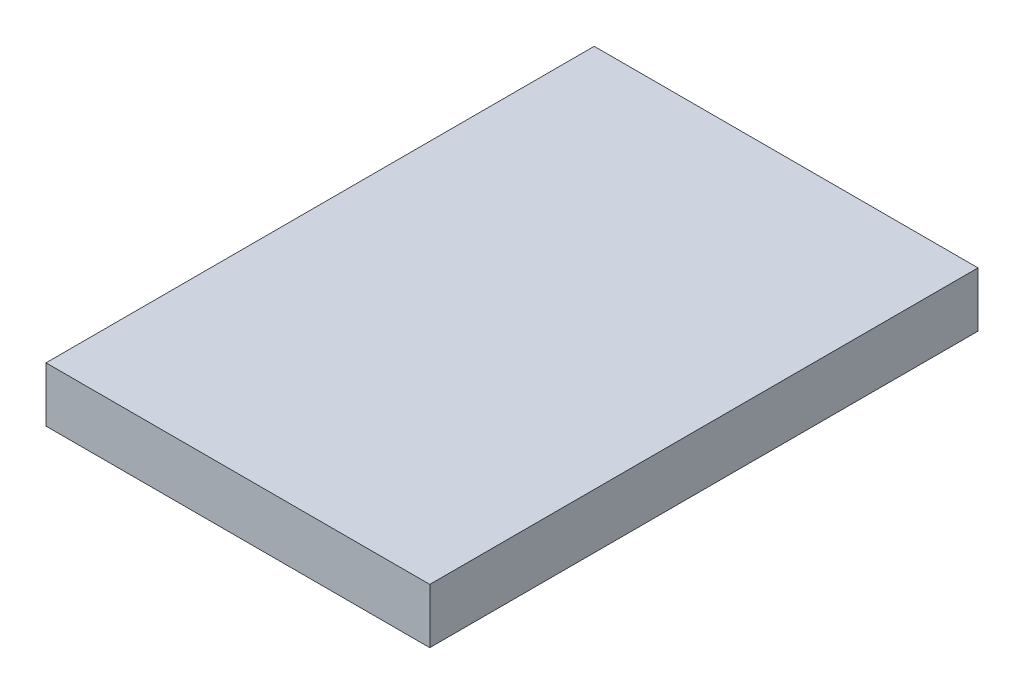
ISO-10303-21;
HEADER;
FILE_DESCRIPTION(('STEP AP214'),'2;1');
FILE_NAME('part.step','',(''),(''),'','','');
FILE_SCHEMA(('AUTOMOTIVE_DESIGN { 1 0 10303 214 1 1 1 1 }'));
ENDSEC;
DATA;
#1=APPLICATION_CONTEXT('core data for automotive mechanical design processes');
#2=APPLICATION_PROTOCOL_DEFINITION('international standard','automotive_design',2000,#1);
#3=PRODUCT_CONTEXT('',#1,'mechanical');
#4=PRODUCT('Part','Part','',(#3));
#5=PRODUCT_RELATED_PRODUCT_CATEGORY('part','',(#4));
#6=PRODUCT_DEFINITION_FORMATION('','',#4);
#7=PRODUCT_DEFINITION_CONTEXT('part definition',#1,'design');
#8=PRODUCT_DEFINITION('design','',#6,#7);
#9=PRODUCT_DEFINITION_SHAPE('','',#8);
#10=(LENGTH_UNIT() NAMED_UNIT(*) SI_UNIT(.MILLI.,.METRE.));
#11=(NAMED_UNIT(*) PLANE_ANGLE_UNIT() SI_UNIT($,.RADIAN.));
#12=(NAMED_UNIT(*) SI_UNIT($,.STERADIAN.) SOLID_ANGLE_UNIT());
#13=UNCERTAINTY_MEASURE_WITH_UNIT(LENGTH_MEASURE(1.E-05),#10,'distance_accuracy_value','');
#14=(GEOMETRIC_REPRESENTATION_CONTEXT(3) GLOBAL_UNCERTAINTY_ASSIGNED_CONTEXT((#13)) GLOBAL_UNIT_ASSIGNED_CONTEXT((#10,
#11,#12)) REPRESENTATION_CONTEXT('',''));
#15=CARTESIAN_POINT('',(0.,0.,0.));
#16=DIRECTION('',(0.,0.,1.));
#17=DIRECTION('',(1.,0.,0.));
#18=AXIS2_PLACEMENT_3D('',#15,#16,#17);
#19=CARTESIAN_POINT('',(0.,12.7,0.));
#20=DIRECTION('',(1.,0.,0.));
#21=DIRECTION('',(0.,0.,-1.));
#22=AXIS2_PLACEMENT_3D('',#19,#20,#21);
#23=PLANE('',#22);
#24=DIRECTION('',(0.,0.,1.));
#25=VECTOR('',#24,1.);
#26=CARTESIAN_POINT('',(0.,0.,0.));
#27=LINE('',#26,#25);
#28=CARTESIAN_POINT('',(0.,0.,-127.));
#29=VERTEX_POINT('',#28);
#30=CARTESIAN_POINT('',(0.,0.,0.));
#31=VERTEX_POINT('',#30);
#32=EDGE_CURVE('E96',#29,#31,#27,.T.);
#33=ORIENTED_EDGE('',*,*,#32,.T.);
#34=DIRECTION('',(0.,-1.,0.));
#35=VECTOR('',#34,1.);
#36=CARTESIAN_POINT('',(0.,12.7,0.));
#37=LINE('',#36,#35);
#38=CARTESIAN_POINT('',(0.,12.7,0.));
#39=VERTEX_POINT('',#38);
#40=EDGE_CURVE('E11',#39,#31,#37,.T.);
#41=ORIENTED_EDGE('',*,*,#40,.F.);
#42=DIRECTION('',(0.,0.,1.));
#43=VECTOR('',#42,1.);
#44=CARTESIAN_POINT('',(0.,12.7,0.));
#45=LINE('',#44,#43);
#46=CARTESIAN_POINT('',(0.,12.7,-127.));
#47=VERTEX_POINT('',#46);
#48=EDGE_CURVE('E84',#47,#39,#45,.T.);
#49=ORIENTED_EDGE('',*,*,#48,.F.);
#50=DIRECTION('',(0.,-1.,0.));
#51=VECTOR('',#50,1.);
#52=CARTESIAN_POINT('',(0.,12.7,-127.));
#53=LINE('',#52,#51);
#54=EDGE_CURVE('E92',#47,#29,#53,.T.);
#55=ORIENTED_EDGE('',*,*,#54,.T.);
#56=EDGE_LOOP('',(#33,#41,#49,#55));
#57=FACE_BOUND('',#56,.T.);
#58=ADVANCED_FACE('F33',(#57),#23,.F.);
#59=CARTESIAN_POINT('',(0.,12.7,0.));
#60=DIRECTION('',(0.,0.,-1.));
#61=DIRECTION('',(-1.,0.,0.));
#62=AXIS2_PLACEMENT_3D('',#59,#60,#61);
#63=PLANE('',#62);
#64=DIRECTION('',(1.,0.,0.));
#65=VECTOR('',#64,1.);
#66=CARTESIAN_POINT('',(0.,0.,0.));
#67=LINE('',#66,#65);
#68=CARTESIAN_POINT('',(88.9,0.,0.));
#69=VERTEX_POINT('',#68);
#70=EDGE_CURVE('E88',#31,#69,#67,.T.);
#71=ORIENTED_EDGE('',*,*,#70,.T.);
#72=DIRECTION('',(0.,-1.,0.));
#73=VECTOR('',#72,1.);
#74=CARTESIAN_POINT('',(88.9,12.7,0.));
#75=LINE('',#74,#73);
#76=CARTESIAN_POINT('',(88.9,12.7,0.));
#77=VERTEX_POINT('',#76);
#78=EDGE_CURVE('E41',#77,#69,#75,.T.);
#79=ORIENTED_EDGE('',*,*,#78,.F.);
#80=DIRECTION('',(1.,0.,0.));
#81=VECTOR('',#80,1.);
#82=CARTESIAN_POINT('',(0.,12.7,0.));
#83=LINE('',#82,#81);
#84=EDGE_CURVE('E79',#39,#77,#83,.T.);
#85=ORIENTED_EDGE('',*,*,#84,.F.);
#86=ORIENTED_EDGE('',*,*,#40,.T.);
#87=EDGE_LOOP('',(#71,#79,#85,#86));
#88=FACE_BOUND('',#87,.T.);
#89=ADVANCED_FACE('F87',(#88),#63,.F.);
#90=CARTESIAN_POINT('',(88.9,12.7,0.));
#91=DIRECTION('',(-1.,0.,0.));
#92=DIRECTION('',(0.,0.,1.));
#93=AXIS2_PLACEMENT_3D('',#90,#91,#92);
#94=PLANE('',#93);
#95=DIRECTION('',(0.,0.,-1.));
#96=VECTOR('',#95,1.);
#97=CARTESIAN_POINT('',(88.9,0.,0.));
#98=LINE('',#97,#96);
#99=CARTESIAN_POINT('',(88.9,0.,-127.));
#100=VERTEX_POINT('',#99);
#101=EDGE_CURVE('E66',#69,#100,#98,.T.);
#102=ORIENTED_EDGE('',*,*,#101,.T.);
#103=DIRECTION('',(0.,-1.,0.));
#104=VECTOR('',#103,1.);
#105=CARTESIAN_POINT('',(88.9,12.7,-127.));
#106=LINE('',#105,#104);
#107=CARTESIAN_POINT('',(88.9,12.7,-127.));
#108=VERTEX_POINT('',#107);
#109=EDGE_CURVE('E89',#108,#100,#106,.T.);
#110=ORIENTED_EDGE('',*,*,#109,.F.);
#111=DIRECTION('',(0.,0.,-1.));
#112=VECTOR('',#111,1.);
#113=CARTESIAN_POINT('',(88.9,12.7,0.));
#114=LINE('',#113,#112);
#115=EDGE_CURVE('E82',#77,#108,#114,.T.);
#116=ORIENTED_EDGE('',*,*,#115,.F.);
#117=ORIENTED_EDGE('',*,*,#78,.T.);
#118=EDGE_LOOP('',(#102,#110,#116,#117));
#119=FACE_BOUND('',#118,.T.);
#120=ADVANCED_FACE('F90',(#119),#94,.F.);
#121=CARTESIAN_POINT('',(0.,12.7,-127.));
#122=DIRECTION('',(0.,0.,1.));
#123=DIRECTION('',(1.,0.,0.));
#124=AXIS2_PLACEMENT_3D('',#121,#122,#123);
#125=PLANE('',#124);
#126=DIRECTION('',(-1.,0.,0.));
#127=VECTOR('',#126,1.);
#128=CARTESIAN_POINT('',(0.,0.,-127.));
#129=LINE('',#128,#127);
#130=EDGE_CURVE('E72',#100,#29,#129,.T.);
#131=ORIENTED_EDGE('',*,*,#130,.T.);
#132=ORIENTED_EDGE('',*,*,#54,.F.);
#133=DIRECTION('',(-1.,0.,0.));
#134=VECTOR('',#133,1.);
#135=CARTESIAN_POINT('',(0.,12.7,-127.));
#136=LINE('',#135,#134);
#137=EDGE_CURVE('E49',#108,#47,#136,.T.);
#138=ORIENTED_EDGE('',*,*,#137,.F.);
#139=ORIENTED_EDGE('',*,*,#109,.T.);
#140=EDGE_LOOP('',(#131,#132,#138,#139));
#141=FACE_BOUND('',#140,.T.);
#142=ADVANCED_FACE('F103',(#141),#125,.F.);
#143=CARTESIAN_POINT('',(0.,12.7,0.));
#144=DIRECTION('',(0.,-1.,0.));
#145=DIRECTION('',(0.,0.,-1.));
#146=AXIS2_PLACEMENT_3D('',#143,#144,#145);
#147=PLANE('',#146);
#148=ORIENTED_EDGE('',*,*,#48,.T.);
#149=ORIENTED_EDGE('',*,*,#84,.T.);
#150=ORIENTED_EDGE('',*,*,#115,.T.);
#151=ORIENTED_EDGE('',*,*,#137,.T.);
#152=EDGE_LOOP('',(#148,#149,#150,#151));
#153=FACE_BOUND('',#152,.T.);
#154=ADVANCED_FACE('F80',(#153),#147,.F.);
#155=CARTESIAN_POINT('',(0.,0.,0.));
#156=DIRECTION('',(0.,-1.,0.));
#157=DIRECTION('',(0.,0.,-1.));
#158=AXIS2_PLACEMENT_3D('',#155,#156,#157);
#159=PLANE('',#158);
#160=ORIENTED_EDGE('',*,*,#32,.F.);
#161=ORIENTED_EDGE('',*,*,#130,.F.);
#162=ORIENTED_EDGE('',*,*,#101,.F.);
#163=ORIENTED_EDGE('',*,*,#70,.F.);
#164=EDGE_LOOP('',(#160,#161,#162,#163));
#165=FACE_BOUND('',#164,.T.);
#166=ADVANCED_FACE('F106',(#165),#159,.T.);
#167=CLOSED_SHELL('',(#58,#89,#120,#142,#154,#166));
#168=MANIFOLD_SOLID_BREP('B2',#167);
#169=ADVANCED_BREP_SHAPE_REPRESENTATION('',(#18,#168),#14);
#170=SHAPE_DEFINITION_REPRESENTATION(#9,#169);
ENDSEC;
END-ISO-10303-21;
